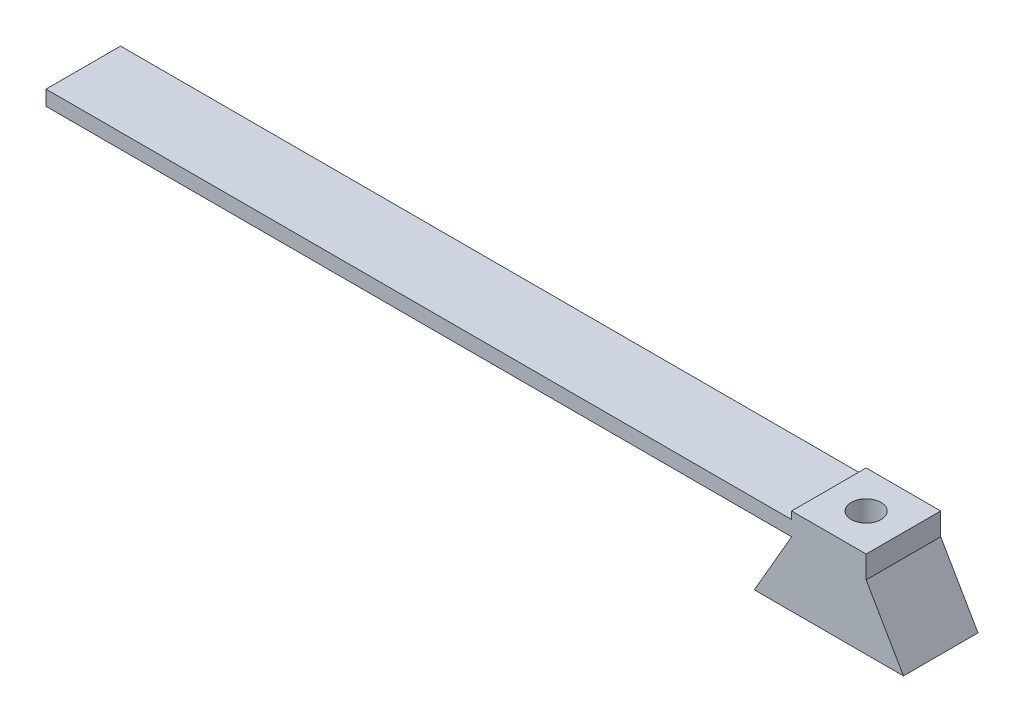
ISO-10303-21;
HEADER;
FILE_DESCRIPTION(('STEP AP214'),'2;1');
FILE_NAME('part.step','',(''),(''),'','','');
FILE_SCHEMA(('AUTOMOTIVE_DESIGN { 1 0 10303 214 1 1 1 1 }'));
ENDSEC;
DATA;
#1=APPLICATION_CONTEXT('core data for automotive mechanical design processes');
#2=APPLICATION_PROTOCOL_DEFINITION('international standard','automotive_design',2000,#1);
#3=PRODUCT_CONTEXT('',#1,'mechanical');
#4=PRODUCT('Part','Part','',(#3));
#5=PRODUCT_RELATED_PRODUCT_CATEGORY('part','',(#4));
#6=PRODUCT_DEFINITION_FORMATION('','',#4);
#7=PRODUCT_DEFINITION_CONTEXT('part definition',#1,'design');
#8=PRODUCT_DEFINITION('design','',#6,#7);
#9=PRODUCT_DEFINITION_SHAPE('','',#8);
#10=(LENGTH_UNIT() NAMED_UNIT(*) SI_UNIT(.MILLI.,.METRE.));
#11=(NAMED_UNIT(*) PLANE_ANGLE_UNIT() SI_UNIT($,.RADIAN.));
#12=(NAMED_UNIT(*) SI_UNIT($,.STERADIAN.) SOLID_ANGLE_UNIT());
#13=UNCERTAINTY_MEASURE_WITH_UNIT(LENGTH_MEASURE(1.E-05),#10,'distance_accuracy_value','');
#14=(GEOMETRIC_REPRESENTATION_CONTEXT(3) GLOBAL_UNCERTAINTY_ASSIGNED_CONTEXT((#13)) GLOBAL_UNIT_ASSIGNED_CONTEXT((#10,
#11,#12)) REPRESENTATION_CONTEXT('',''));
#15=CARTESIAN_POINT('',(0.,0.,0.));
#16=DIRECTION('',(0.,0.,1.));
#17=DIRECTION('',(1.,0.,0.));
#18=AXIS2_PLACEMENT_3D('',#15,#16,#17);
#19=CARTESIAN_POINT('',(200.,0.,100.));
#20=DIRECTION('',(0.,1.,0.));
#21=DIRECTION('',(0.,0.,1.));
#22=AXIS2_PLACEMENT_3D('',#19,#20,#21);
#23=PLANE('',#22);
#24=CARTESIAN_POINT('',(100.,0.,50.));
#25=DIRECTION('',(0.,1.,0.));
#26=DIRECTION('',(0.,0.,1.));
#27=AXIS2_PLACEMENT_3D('',#24,#25,#26);
#28=CIRCLE('',#27,20.);
#29=CARTESIAN_POINT('',(100.,0.,70.));
#30=VERTEX_POINT('',#29);
#31=EDGE_CURVE('E243',#30,#30,#28,.T.);
#32=ORIENTED_EDGE('',*,*,#31,.T.);
#33=EDGE_LOOP('',(#32));
#34=FACE_BOUND('',#33,.T.);
#35=DIRECTION('',(1.,0.,0.));
#36=VECTOR('',#35,1.);
#37=CARTESIAN_POINT('',(200.,0.,0.));
#38=LINE('',#37,#36);
#39=CARTESIAN_POINT('',(0.,0.,0.));
#40=VERTEX_POINT('',#39);
#41=CARTESIAN_POINT('',(200.,0.,0.));
#42=VERTEX_POINT('',#41);
#43=EDGE_CURVE('E180',#40,#42,#38,.T.);
#44=ORIENTED_EDGE('',*,*,#43,.T.);
#45=DIRECTION('',(0.,0.,-1.));
#46=VECTOR('',#45,1.);
#47=CARTESIAN_POINT('',(200.,0.,100.));
#48=LINE('',#47,#46);
#49=CARTESIAN_POINT('',(200.,0.,100.));
#50=VERTEX_POINT('',#49);
#51=EDGE_CURVE('E11',#50,#42,#48,.T.);
#52=ORIENTED_EDGE('',*,*,#51,.F.);
#53=DIRECTION('',(1.,0.,0.));
#54=VECTOR('',#53,1.);
#55=CARTESIAN_POINT('',(200.,0.,100.));
#56=LINE('',#55,#54);
#57=CARTESIAN_POINT('',(0.,0.,100.));
#58=VERTEX_POINT('',#57);
#59=EDGE_CURVE('E181',#58,#50,#56,.T.);
#60=ORIENTED_EDGE('',*,*,#59,.F.);
#61=DIRECTION('',(0.,0.,-1.));
#62=VECTOR('',#61,1.);
#63=CARTESIAN_POINT('',(0.,0.,100.));
#64=LINE('',#63,#62);
#65=EDGE_CURVE('E185',#58,#40,#64,.T.);
#66=ORIENTED_EDGE('',*,*,#65,.T.);
#67=EDGE_LOOP('',(#44,#52,#60,#66));
#68=FACE_BOUND('',#67,.T.);
#69=ADVANCED_FACE('F43',(#34,#68),#23,.F.);
#70=CARTESIAN_POINT('',(150.,86.6025403784443,100.));
#71=DIRECTION('',(-0.86602540378444,-0.499999999999998,0.));
#72=DIRECTION('',(0.499999999999998,-0.86602540378444,0.));
#73=AXIS2_PLACEMENT_3D('',#70,#71,#72);
#74=PLANE('',#73);
#75=DIRECTION('',(-0.499999999999998,0.86602540378444,0.));
#76=VECTOR('',#75,1.);
#77=CARTESIAN_POINT('',(150.,86.6025403784443,0.));
#78=LINE('',#77,#76);
#79=CARTESIAN_POINT('',(150.,86.6025403784443,0.));
#80=VERTEX_POINT('',#79);
#81=EDGE_CURVE('E188',#42,#80,#78,.T.);
#82=ORIENTED_EDGE('',*,*,#81,.T.);
#83=DIRECTION('',(0.,0.,-1.));
#84=VECTOR('',#83,1.);
#85=CARTESIAN_POINT('',(150.,86.6025403784443,100.));
#86=LINE('',#85,#84);
#87=CARTESIAN_POINT('',(150.,86.6025403784443,100.));
#88=VERTEX_POINT('',#87);
#89=EDGE_CURVE('E50',#88,#80,#86,.T.);
#90=ORIENTED_EDGE('',*,*,#89,.F.);
#91=DIRECTION('',(-0.499999999999998,0.86602540378444,0.));
#92=VECTOR('',#91,1.);
#93=CARTESIAN_POINT('',(150.,86.6025403784443,100.));
#94=LINE('',#93,#92);
#95=EDGE_CURVE('E86',#50,#88,#94,.T.);
#96=ORIENTED_EDGE('',*,*,#95,.F.);
#97=ORIENTED_EDGE('',*,*,#51,.T.);
#98=EDGE_LOOP('',(#82,#90,#96,#97));
#99=FACE_BOUND('',#98,.T.);
#100=ADVANCED_FACE('F202',(#99),#74,.F.);
#101=CARTESIAN_POINT('',(0.,0.,100.));
#102=DIRECTION('',(0.86602540378444,-0.499999999999998,0.));
#103=DIRECTION('',(0.499999999999998,0.86602540378444,0.));
#104=AXIS2_PLACEMENT_3D('',#101,#102,#103);
#105=PLANE('',#104);
#106=DIRECTION('',(-0.499999999999998,-0.86602540378444,0.));
#107=VECTOR('',#106,1.);
#108=CARTESIAN_POINT('',(0.,0.,0.));
#109=LINE('',#108,#107);
#110=CARTESIAN_POINT('',(50.,86.6025403784443,0.));
#111=VERTEX_POINT('',#110);
#112=EDGE_CURVE('E81',#111,#40,#109,.T.);
#113=ORIENTED_EDGE('',*,*,#112,.T.);
#114=ORIENTED_EDGE('',*,*,#65,.F.);
#115=DIRECTION('',(-0.499999999999998,-0.86602540378444,0.));
#116=VECTOR('',#115,1.);
#117=CARTESIAN_POINT('',(0.,0.,100.));
#118=LINE('',#117,#116);
#119=CARTESIAN_POINT('',(50.,86.6025403784443,100.));
#120=VERTEX_POINT('',#119);
#121=EDGE_CURVE('E66',#120,#58,#118,.T.);
#122=ORIENTED_EDGE('',*,*,#121,.F.);
#123=DIRECTION('',(0.,0.,-1.));
#124=VECTOR('',#123,1.);
#125=CARTESIAN_POINT('',(50.,86.6025403784443,100.));
#126=LINE('',#125,#124);
#127=EDGE_CURVE('E192',#120,#111,#126,.T.);
#128=ORIENTED_EDGE('',*,*,#127,.T.);
#129=EDGE_LOOP('',(#113,#114,#122,#128));
#130=FACE_BOUND('',#129,.T.);
#131=ADVANCED_FACE('F193',(#130),#105,.F.);
#132=CARTESIAN_POINT('',(0.,0.,100.));
#133=DIRECTION('',(0.,0.,-1.));
#134=DIRECTION('',(-1.,0.,0.));
#135=AXIS2_PLACEMENT_3D('',#132,#133,#134);
#136=PLANE('',#135);
#137=ORIENTED_EDGE('',*,*,#59,.T.);
#138=ORIENTED_EDGE('',*,*,#95,.T.);
#139=DIRECTION('',(0.,-1.,0.));
#140=VECTOR('',#139,1.);
#141=CARTESIAN_POINT('',(150.,106.602540378444,100.));
#142=LINE('',#141,#140);
#143=CARTESIAN_POINT('',(150.,116.602540378444,100.));
#144=VERTEX_POINT('',#143);
#145=EDGE_CURVE('E131',#144,#88,#142,.T.);
#146=ORIENTED_EDGE('',*,*,#145,.F.);
#147=DIRECTION('',(1.,0.,0.));
#148=VECTOR('',#147,1.);
#149=CARTESIAN_POINT('',(150.,116.602540378444,100.));
#150=LINE('',#149,#148);
#151=CARTESIAN_POINT('',(49.9999999999999,116.602540378444,100.));
#152=VERTEX_POINT('',#151);
#153=EDGE_CURVE('E148',#152,#144,#150,.T.);
#154=ORIENTED_EDGE('',*,*,#153,.F.);
#155=DIRECTION('',(0.,-1.,0.));
#156=VECTOR('',#155,1.);
#157=CARTESIAN_POINT('',(49.9999999999999,116.602540378444,100.));
#158=LINE('',#157,#156);
#159=CARTESIAN_POINT('',(49.9999999999999,106.602540378444,100.));
#160=VERTEX_POINT('',#159);
#161=EDGE_CURVE('E156',#152,#160,#158,.T.);
#162=ORIENTED_EDGE('',*,*,#161,.T.);
#163=DIRECTION('',(1.,0.,0.));
#164=VECTOR('',#163,1.);
#165=CARTESIAN_POINT('',(50.,106.602540378444,100.));
#166=LINE('',#165,#164);
#167=CARTESIAN_POINT('',(-950.,106.602540378444,100.));
#168=VERTEX_POINT('',#167);
#169=EDGE_CURVE('E176',#168,#160,#166,.T.);
#170=ORIENTED_EDGE('',*,*,#169,.F.);
#171=DIRECTION('',(0.,1.,0.));
#172=VECTOR('',#171,1.);
#173=CARTESIAN_POINT('',(-950.,106.602540378444,100.));
#174=LINE('',#173,#172);
#175=CARTESIAN_POINT('',(-950.,86.6025403784443,100.));
#176=VERTEX_POINT('',#175);
#177=EDGE_CURVE('E166',#176,#168,#174,.T.);
#178=ORIENTED_EDGE('',*,*,#177,.F.);
#179=DIRECTION('',(1.,0.,0.));
#180=VECTOR('',#179,1.);
#181=CARTESIAN_POINT('',(-950.,86.6025403784443,100.));
#182=LINE('',#181,#180);
#183=EDGE_CURVE('E172',#176,#120,#182,.T.);
#184=ORIENTED_EDGE('',*,*,#183,.T.);
#185=ORIENTED_EDGE('',*,*,#121,.T.);
#186=EDGE_LOOP('',(#137,#138,#146,#154,#162,#170,#178,#184,#185));
#187=FACE_BOUND('',#186,.T.);
#188=ADVANCED_FACE('F201',(#187),#136,.F.);
#189=CARTESIAN_POINT('',(0.,0.,0.));
#190=DIRECTION('',(0.,0.,-1.));
#191=DIRECTION('',(-1.,0.,0.));
#192=AXIS2_PLACEMENT_3D('',#189,#190,#191);
#193=PLANE('',#192);
#194=ORIENTED_EDGE('',*,*,#43,.F.);
#195=ORIENTED_EDGE('',*,*,#112,.F.);
#196=DIRECTION('',(1.,0.,0.));
#197=VECTOR('',#196,1.);
#198=CARTESIAN_POINT('',(-950.,86.6025403784443,0.));
#199=LINE('',#198,#197);
#200=CARTESIAN_POINT('',(-950.,86.6025403784443,0.));
#201=VERTEX_POINT('',#200);
#202=EDGE_CURVE('E174',#201,#111,#199,.T.);
#203=ORIENTED_EDGE('',*,*,#202,.F.);
#204=DIRECTION('',(0.,-1.,0.));
#205=VECTOR('',#204,1.);
#206=CARTESIAN_POINT('',(-950.,106.602540378444,0.));
#207=LINE('',#206,#205);
#208=CARTESIAN_POINT('',(-950.,106.602540378444,0.));
#209=VERTEX_POINT('',#208);
#210=EDGE_CURVE('E161',#209,#201,#207,.T.);
#211=ORIENTED_EDGE('',*,*,#210,.F.);
#212=DIRECTION('',(-1.,0.,0.));
#213=VECTOR('',#212,1.);
#214=CARTESIAN_POINT('',(50.,106.602540378444,0.));
#215=LINE('',#214,#213);
#216=CARTESIAN_POINT('',(50.,106.602540378444,0.));
#217=VERTEX_POINT('',#216);
#218=EDGE_CURVE('E132',#217,#209,#215,.T.);
#219=ORIENTED_EDGE('',*,*,#218,.F.);
#220=DIRECTION('',(0.,-1.,0.));
#221=VECTOR('',#220,1.);
#222=CARTESIAN_POINT('',(50.,116.602540378444,0.));
#223=LINE('',#222,#221);
#224=CARTESIAN_POINT('',(50.,116.602540378444,0.));
#225=VERTEX_POINT('',#224);
#226=EDGE_CURVE('E139',#225,#217,#223,.T.);
#227=ORIENTED_EDGE('',*,*,#226,.F.);
#228=DIRECTION('',(-1.,0.,0.));
#229=VECTOR('',#228,1.);
#230=CARTESIAN_POINT('',(150.,116.602540378444,0.));
#231=LINE('',#230,#229);
#232=CARTESIAN_POINT('',(150.,116.602540378444,0.));
#233=VERTEX_POINT('',#232);
#234=EDGE_CURVE('E135',#233,#225,#231,.T.);
#235=ORIENTED_EDGE('',*,*,#234,.F.);
#236=DIRECTION('',(0.,-1.,0.));
#237=VECTOR('',#236,1.);
#238=CARTESIAN_POINT('',(150.,106.602540378444,0.));
#239=LINE('',#238,#237);
#240=EDGE_CURVE('E124',#233,#80,#239,.T.);
#241=ORIENTED_EDGE('',*,*,#240,.T.);
#242=ORIENTED_EDGE('',*,*,#81,.F.);
#243=EDGE_LOOP('',(#194,#195,#203,#211,#219,#227,#235,#241,#242));
#244=FACE_BOUND('',#243,.T.);
#245=ADVANCED_FACE('F137',(#244),#193,.T.);
#246=CARTESIAN_POINT('',(150.,106.602540378444,0.));
#247=DIRECTION('',(-1.,0.,0.));
#248=DIRECTION('',(0.,0.,1.));
#249=AXIS2_PLACEMENT_3D('',#246,#247,#248);
#250=PLANE('',#249);
#251=ORIENTED_EDGE('',*,*,#89,.T.);
#252=ORIENTED_EDGE('',*,*,#240,.F.);
#253=DIRECTION('',(0.,0.,-1.));
#254=VECTOR('',#253,1.);
#255=CARTESIAN_POINT('',(150.,116.602540378444,0.));
#256=LINE('',#255,#254);
#257=EDGE_CURVE('E129',#144,#233,#256,.T.);
#258=ORIENTED_EDGE('',*,*,#257,.F.);
#259=ORIENTED_EDGE('',*,*,#145,.T.);
#260=EDGE_LOOP('',(#251,#252,#258,#259));
#261=FACE_BOUND('',#260,.T.);
#262=ADVANCED_FACE('F126',(#261),#250,.F.);
#263=CARTESIAN_POINT('',(0.,106.602540378444,0.));
#264=DIRECTION('',(0.,1.,0.));
#265=DIRECTION('',(0.,0.,1.));
#266=AXIS2_PLACEMENT_3D('',#263,#264,#265);
#267=PLANE('',#266);
#268=DIRECTION('',(0.,0.,1.));
#269=VECTOR('',#268,1.);
#270=CARTESIAN_POINT('',(50.,106.602540378444,0.));
#271=LINE('',#270,#269);
#272=EDGE_CURVE('E57',#217,#160,#271,.T.);
#273=ORIENTED_EDGE('',*,*,#272,.F.);
#274=ORIENTED_EDGE('',*,*,#218,.T.);
#275=DIRECTION('',(0.,0.,-1.));
#276=VECTOR('',#275,1.);
#277=CARTESIAN_POINT('',(-950.,106.602540378444,0.));
#278=LINE('',#277,#276);
#279=EDGE_CURVE('E169',#168,#209,#278,.T.);
#280=ORIENTED_EDGE('',*,*,#279,.F.);
#281=ORIENTED_EDGE('',*,*,#169,.T.);
#282=EDGE_LOOP('',(#273,#274,#280,#281));
#283=FACE_BOUND('',#282,.T.);
#284=ADVANCED_FACE('F218',(#283),#267,.T.);
#285=CARTESIAN_POINT('',(-950.,86.6025403784443,0.));
#286=DIRECTION('',(0.,1.,0.));
#287=DIRECTION('',(0.,0.,1.));
#288=AXIS2_PLACEMENT_3D('',#285,#286,#287);
#289=PLANE('',#288);
#290=ORIENTED_EDGE('',*,*,#127,.F.);
#291=ORIENTED_EDGE('',*,*,#183,.F.);
#292=DIRECTION('',(0.,0.,1.));
#293=VECTOR('',#292,1.);
#294=CARTESIAN_POINT('',(-950.,86.6025403784443,0.));
#295=LINE('',#294,#293);
#296=EDGE_CURVE('E164',#201,#176,#295,.T.);
#297=ORIENTED_EDGE('',*,*,#296,.F.);
#298=ORIENTED_EDGE('',*,*,#202,.T.);
#299=EDGE_LOOP('',(#290,#291,#297,#298));
#300=FACE_BOUND('',#299,.T.);
#301=ADVANCED_FACE('F220',(#300),#289,.F.);
#302=CARTESIAN_POINT('',(-950.,0.,0.));
#303=DIRECTION('',(-1.,0.,0.));
#304=DIRECTION('',(0.,0.,1.));
#305=AXIS2_PLACEMENT_3D('',#302,#303,#304);
#306=PLANE('',#305);
#307=ORIENTED_EDGE('',*,*,#210,.T.);
#308=ORIENTED_EDGE('',*,*,#296,.T.);
#309=ORIENTED_EDGE('',*,*,#177,.T.);
#310=ORIENTED_EDGE('',*,*,#279,.T.);
#311=EDGE_LOOP('',(#307,#308,#309,#310));
#312=FACE_BOUND('',#311,.T.);
#313=ADVANCED_FACE('F223',(#312),#306,.T.);
#314=CARTESIAN_POINT('',(0.,116.602540378444,0.));
#315=DIRECTION('',(0.,-1.,0.));
#316=DIRECTION('',(0.,0.,-1.));
#317=AXIS2_PLACEMENT_3D('',#314,#315,#316);
#318=PLANE('',#317);
#319=ORIENTED_EDGE('',*,*,#257,.T.);
#320=ORIENTED_EDGE('',*,*,#234,.T.);
#321=DIRECTION('',(0.,0.,1.));
#322=VECTOR('',#321,1.);
#323=CARTESIAN_POINT('',(50.,116.602540378444,0.));
#324=LINE('',#323,#322);
#325=EDGE_CURVE('E142',#225,#152,#324,.T.);
#326=ORIENTED_EDGE('',*,*,#325,.T.);
#327=ORIENTED_EDGE('',*,*,#153,.T.);
#328=EDGE_LOOP('',(#319,#320,#326,#327));
#329=FACE_BOUND('',#328,.T.);
#330=CARTESIAN_POINT('',(100.,116.602540378444,50.));
#331=DIRECTION('',(0.,1.,0.));
#332=DIRECTION('',(0.,0.,1.));
#333=AXIS2_PLACEMENT_3D('',#330,#331,#332);
#334=CIRCLE('',#333,20.);
#335=CARTESIAN_POINT('',(100.,116.602540378444,70.));
#336=VERTEX_POINT('',#335);
#337=EDGE_CURVE('E150',#336,#336,#334,.T.);
#338=ORIENTED_EDGE('',*,*,#337,.F.);
#339=EDGE_LOOP('',(#338));
#340=FACE_BOUND('',#339,.T.);
#341=ADVANCED_FACE('F145',(#329,#340),#318,.F.);
#342=CARTESIAN_POINT('',(50.,116.602540378444,0.));
#343=DIRECTION('',(1.,0.,0.));
#344=DIRECTION('',(0.,0.,-1.));
#345=AXIS2_PLACEMENT_3D('',#342,#343,#344);
#346=PLANE('',#345);
#347=ORIENTED_EDGE('',*,*,#272,.T.);
#348=ORIENTED_EDGE('',*,*,#161,.F.);
#349=ORIENTED_EDGE('',*,*,#325,.F.);
#350=ORIENTED_EDGE('',*,*,#226,.T.);
#351=EDGE_LOOP('',(#347,#348,#349,#350));
#352=FACE_BOUND('',#351,.T.);
#353=ADVANCED_FACE('F227',(#352),#346,.F.);
#354=CARTESIAN_POINT('',(100.,116.602540378444,50.));
#355=DIRECTION('',(0.,-1.,0.));
#356=DIRECTION('',(0.,0.,-1.));
#357=AXIS2_PLACEMENT_3D('',#354,#355,#356);
#358=CYLINDRICAL_SURFACE('',#357,20.);
#359=ORIENTED_EDGE('',*,*,#337,.T.);
#360=EDGE_LOOP('',(#359));
#361=FACE_BOUND('',#360,.T.);
#362=ORIENTED_EDGE('',*,*,#31,.F.);
#363=EDGE_LOOP('',(#362));
#364=FACE_BOUND('',#363,.T.);
#365=ADVANCED_FACE('F230',(#361,#364),#358,.F.);
#366=CLOSED_SHELL('',(#69,#100,#131,#188,#245,#262,#284,#301,#313,#341,#353,#365));
#367=MANIFOLD_SOLID_BREP('B2',#366);
#368=ADVANCED_BREP_SHAPE_REPRESENTATION('',(#18,#367),#14);
#369=SHAPE_DEFINITION_REPRESENTATION(#9,#368);
ENDSEC;
END-ISO-10303-21;
